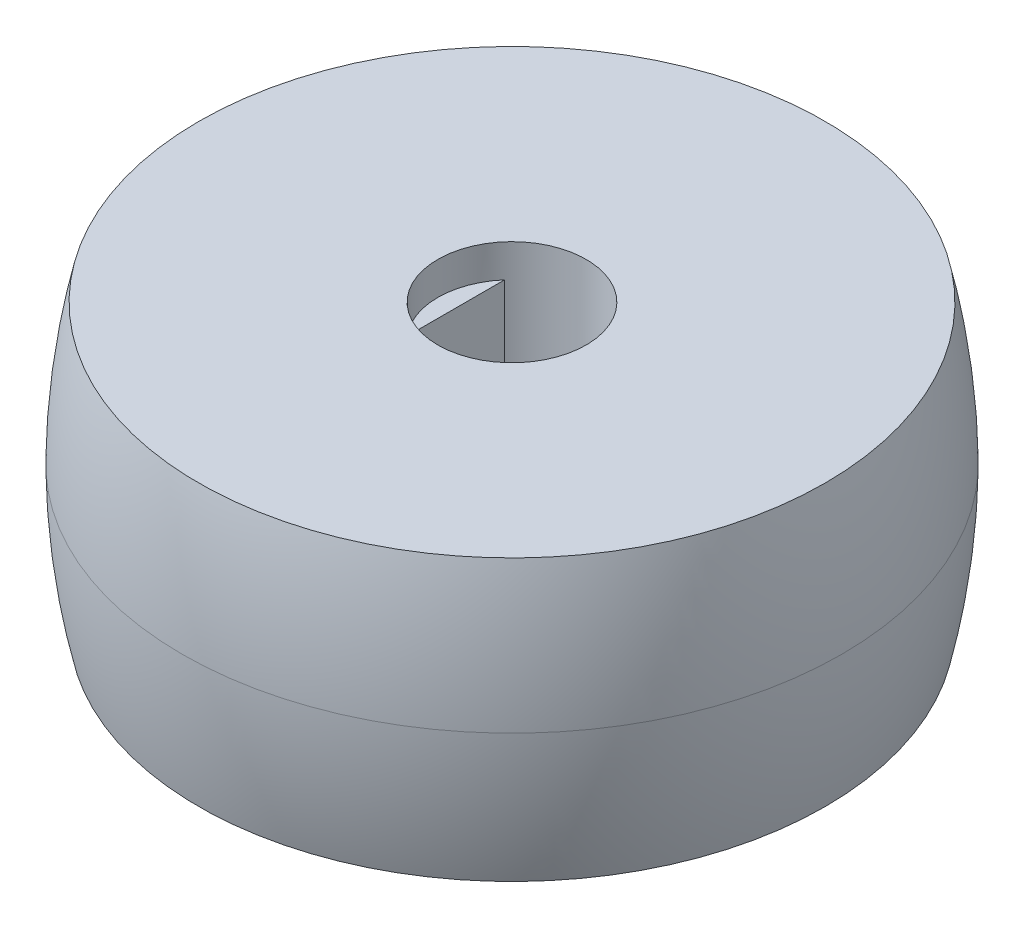
ISO-10303-21;
HEADER;
FILE_DESCRIPTION(('STEP AP214'),'2;1');
FILE_NAME('part.step','',(''),(''),'','','');
FILE_SCHEMA(('AUTOMOTIVE_DESIGN { 1 0 10303 214 1 1 1 1 }'));
ENDSEC;
DATA;
#1=APPLICATION_CONTEXT('core data for automotive mechanical design processes');
#2=APPLICATION_PROTOCOL_DEFINITION('international standard','automotive_design',2000,#1);
#3=PRODUCT_CONTEXT('',#1,'mechanical');
#4=PRODUCT('Part','Part','',(#3));
#5=PRODUCT_RELATED_PRODUCT_CATEGORY('part','',(#4));
#6=PRODUCT_DEFINITION_FORMATION('','',#4);
#7=PRODUCT_DEFINITION_CONTEXT('part definition',#1,'design');
#8=PRODUCT_DEFINITION('design','',#6,#7);
#9=PRODUCT_DEFINITION_SHAPE('','',#8);
#10=(LENGTH_UNIT() NAMED_UNIT(*) SI_UNIT(.MILLI.,.METRE.));
#11=(NAMED_UNIT(*) PLANE_ANGLE_UNIT() SI_UNIT($,.RADIAN.));
#12=(NAMED_UNIT(*) SI_UNIT($,.STERADIAN.) SOLID_ANGLE_UNIT());
#13=UNCERTAINTY_MEASURE_WITH_UNIT(LENGTH_MEASURE(1.E-05),#10,'distance_accuracy_value','');
#14=(GEOMETRIC_REPRESENTATION_CONTEXT(3) GLOBAL_UNCERTAINTY_ASSIGNED_CONTEXT((#13)) GLOBAL_UNIT_ASSIGNED_CONTEXT((#10,
#11,#12)) REPRESENTATION_CONTEXT('',''));
#15=CARTESIAN_POINT('',(0.,0.,0.));
#16=DIRECTION('',(0.,0.,1.));
#17=DIRECTION('',(1.,0.,0.));
#18=AXIS2_PLACEMENT_3D('',#15,#16,#17);
#19=CARTESIAN_POINT('',(0.,6.49999999999999,0.));
#20=DIRECTION('',(0.,1.,0.));
#21=DIRECTION('',(0.,0.,1.));
#22=AXIS2_PLACEMENT_3D('',#19,#20,#21);
#23=PLANE('',#22);
#24=CARTESIAN_POINT('',(0.,6.49999999999999,0.));
#25=DIRECTION('',(0.,1.,0.));
#26=DIRECTION('',(0.,0.,1.));
#27=AXIS2_PLACEMENT_3D('',#24,#25,#26);
#28=CIRCLE('',#27,4.5);
#29=CARTESIAN_POINT('',(-3.4,6.49999999999999,-2.94788059459674));
#30=VERTEX_POINT('',#29);
#31=CARTESIAN_POINT('',(-3.4,6.49999999999999,2.94788059459674));
#32=VERTEX_POINT('',#31);
#33=EDGE_CURVE('E138',#30,#32,#28,.T.);
#34=ORIENTED_EDGE('',*,*,#33,.T.);
#35=DIRECTION('',(0.,0.,-1.));
#36=VECTOR('',#35,1.);
#37=CARTESIAN_POINT('',(-3.4,6.49999999999999,0.));
#38=LINE('',#37,#36);
#39=EDGE_CURVE('E71',#32,#30,#38,.T.);
#40=ORIENTED_EDGE('',*,*,#39,.T.);
#41=EDGE_LOOP('',(#34,#40));
#42=FACE_BOUND('',#41,.T.);
#43=ADVANCED_FACE('F56',(#42),#23,.T.);
#44=CARTESIAN_POINT('',(0.,-8.49999999999999,0.));
#45=DIRECTION('',(0.,1.,0.));
#46=DIRECTION('',(0.,0.,1.));
#47=AXIS2_PLACEMENT_3D('',#44,#45,#46);
#48=CYLINDRICAL_SURFACE('',#47,1.65);
#49=CARTESIAN_POINT('',(0.,-8.49999999999999,0.));
#50=DIRECTION('',(0.,1.,0.));
#51=DIRECTION('',(0.,0.,1.));
#52=AXIS2_PLACEMENT_3D('',#49,#50,#51);
#53=CIRCLE('',#52,1.65);
#54=CARTESIAN_POINT('',(0.,-8.49999999999999,1.65));
#55=VERTEX_POINT('',#54);
#56=EDGE_CURVE('E131',#55,#55,#53,.T.);
#57=ORIENTED_EDGE('',*,*,#56,.F.);
#58=EDGE_LOOP('',(#57));
#59=FACE_BOUND('',#58,.T.);
#60=CARTESIAN_POINT('',(0.,1.99999999999999,0.));
#61=DIRECTION('',(0.,1.,0.));
#62=DIRECTION('',(0.,0.,1.));
#63=AXIS2_PLACEMENT_3D('',#60,#61,#62);
#64=CIRCLE('',#63,1.65);
#65=CARTESIAN_POINT('',(0.,1.99999999999999,1.65));
#66=VERTEX_POINT('',#65);
#67=EDGE_CURVE('E126',#66,#66,#64,.T.);
#68=ORIENTED_EDGE('',*,*,#67,.T.);
#69=EDGE_LOOP('',(#68));
#70=FACE_BOUND('',#69,.T.);
#71=ADVANCED_FACE('F159',(#59,#70),#48,.F.);
#72=CARTESIAN_POINT('',(0.,0.396827241567,0.));
#73=DIRECTION('',(0.,1.,0.));
#74=DIRECTION('',(-1.,0.,0.));
#75=AXIS2_PLACEMENT_3D('',#72,#73,#74);
#76=DEGENERATE_TOROIDAL_SURFACE('',#75,19.9980315533196,40.,.F.);
#77=CARTESIAN_POINT('',(0.,0.,0.));
#78=DIRECTION('',(0.,1.,0.));
#79=DIRECTION('',(-1.,0.,0.));
#80=AXIS2_PLACEMENT_3D('',#77,#78,#79);
#81=CIRCLE('',#80,20.);
#82=CARTESIAN_POINT('',(-20.,0.,0.));
#83=VERTEX_POINT('',#82);
#84=EDGE_CURVE('E12',#83,#83,#81,.T.);
#85=ORIENTED_EDGE('',*,*,#84,.F.);
#86=EDGE_LOOP('',(#85));
#87=FACE_BOUND('',#86,.T.);
#88=CARTESIAN_POINT('',(0.,-8.49999999999999,0.));
#89=DIRECTION('',(0.,1.,0.));
#90=DIRECTION('',(-1.,0.,0.));
#91=AXIS2_PLACEMENT_3D('',#88,#89,#90);
#92=CIRCLE('',#91,19.);
#93=CARTESIAN_POINT('',(-19.,-8.49999999999999,0.));
#94=VERTEX_POINT('',#93);
#95=EDGE_CURVE('E64',#94,#94,#92,.T.);
#96=ORIENTED_EDGE('',*,*,#95,.T.);
#97=EDGE_LOOP('',(#96));
#98=FACE_BOUND('',#97,.T.);
#99=ADVANCED_FACE('F58',(#87,#98),#76,.F.);
#100=CARTESIAN_POINT('',(0.,-8.49999999999999,0.));
#101=DIRECTION('',(0.,1.,0.));
#102=DIRECTION('',(-1.,0.,0.));
#103=AXIS2_PLACEMENT_3D('',#100,#101,#102);
#104=PLANE('',#103);
#105=ORIENTED_EDGE('',*,*,#56,.T.);
#106=EDGE_LOOP('',(#105));
#107=FACE_BOUND('',#106,.T.);
#108=ORIENTED_EDGE('',*,*,#95,.F.);
#109=EDGE_LOOP('',(#108));
#110=FACE_BOUND('',#109,.T.);
#111=ADVANCED_FACE('F146',(#107,#110),#104,.F.);
#112=CARTESIAN_POINT('',(0.,-0.396827241567,0.));
#113=DIRECTION('',(0.,-1.,0.));
#114=DIRECTION('',(-1.,0.,0.));
#115=AXIS2_PLACEMENT_3D('',#112,#113,#114);
#116=DEGENERATE_TOROIDAL_SURFACE('',#115,19.9980315533196,40.,.F.);
#117=ORIENTED_EDGE('',*,*,#84,.T.);
#118=EDGE_LOOP('',(#117));
#119=FACE_BOUND('',#118,.T.);
#120=CARTESIAN_POINT('',(0.,8.49999999999999,0.));
#121=DIRECTION('',(0.,1.,0.));
#122=DIRECTION('',(-1.,0.,0.));
#123=AXIS2_PLACEMENT_3D('',#120,#121,#122);
#124=CIRCLE('',#123,19.);
#125=CARTESIAN_POINT('',(-19.,8.49999999999999,0.));
#126=VERTEX_POINT('',#125);
#127=EDGE_CURVE('E137',#126,#126,#124,.T.);
#128=ORIENTED_EDGE('',*,*,#127,.F.);
#129=EDGE_LOOP('',(#128));
#130=FACE_BOUND('',#129,.T.);
#131=ADVANCED_FACE('F148',(#119,#130),#116,.F.);
#132=CARTESIAN_POINT('',(0.,8.49999999999999,0.));
#133=DIRECTION('',(0.,-1.,0.));
#134=DIRECTION('',(-1.,0.,0.));
#135=AXIS2_PLACEMENT_3D('',#132,#133,#134);
#136=PLANE('',#135);
#137=CARTESIAN_POINT('',(0.,8.49999999999999,0.));
#138=DIRECTION('',(0.,1.,0.));
#139=DIRECTION('',(0.,0.,1.));
#140=AXIS2_PLACEMENT_3D('',#137,#138,#139);
#141=CIRCLE('',#140,4.5);
#142=CARTESIAN_POINT('',(0.,8.49999999999999,4.5));
#143=VERTEX_POINT('',#142);
#144=EDGE_CURVE('E134',#143,#143,#141,.T.);
#145=ORIENTED_EDGE('',*,*,#144,.F.);
#146=EDGE_LOOP('',(#145));
#147=FACE_BOUND('',#146,.T.);
#148=ORIENTED_EDGE('',*,*,#127,.T.);
#149=EDGE_LOOP('',(#148));
#150=FACE_BOUND('',#149,.T.);
#151=ADVANCED_FACE('F155',(#147,#150),#136,.F.);
#152=CARTESIAN_POINT('',(0.,6.49999999999999,0.));
#153=DIRECTION('',(0.,1.,0.));
#154=DIRECTION('',(0.,0.,1.));
#155=AXIS2_PLACEMENT_3D('',#152,#153,#154);
#156=CYLINDRICAL_SURFACE('',#155,4.5);
#157=CARTESIAN_POINT('',(3.4,6.49999999999999,2.94788059459673));
#158=VERTEX_POINT('',#157);
#159=CARTESIAN_POINT('',(3.4,6.49999999999999,-2.94788059459674));
#160=VERTEX_POINT('',#159);
#161=EDGE_CURVE('E135',#158,#160,#28,.T.);
#162=ORIENTED_EDGE('',*,*,#161,.F.);
#163=DIRECTION('',(0.,1.,0.));
#164=VECTOR('',#163,1.);
#165=CARTESIAN_POINT('',(3.4,1.99999999999999,2.94788059459673));
#166=LINE('',#165,#164);
#167=CARTESIAN_POINT('',(3.4,1.99999999999999,2.94788059459673));
#168=VERTEX_POINT('',#167);
#169=EDGE_CURVE('E93',#168,#158,#166,.T.);
#170=ORIENTED_EDGE('',*,*,#169,.F.);
#171=CARTESIAN_POINT('',(0.,1.99999999999999,0.));
#172=DIRECTION('',(0.,1.,0.));
#173=DIRECTION('',(0.,0.,1.));
#174=AXIS2_PLACEMENT_3D('',#171,#172,#173);
#175=CIRCLE('',#174,4.5);
#176=CARTESIAN_POINT('',(-3.4,1.99999999999999,2.94788059459674));
#177=VERTEX_POINT('',#176);
#178=EDGE_CURVE('E120',#177,#168,#175,.T.);
#179=ORIENTED_EDGE('',*,*,#178,.F.);
#180=DIRECTION('',(0.,1.,0.));
#181=VECTOR('',#180,1.);
#182=CARTESIAN_POINT('',(-3.4,1.99999999999999,2.94788059459674));
#183=LINE('',#182,#181);
#184=EDGE_CURVE('E76',#177,#32,#183,.T.);
#185=ORIENTED_EDGE('',*,*,#184,.T.);
#186=ORIENTED_EDGE('',*,*,#33,.F.);
#187=DIRECTION('',(0.,1.,0.));
#188=VECTOR('',#187,1.);
#189=CARTESIAN_POINT('',(-3.4,1.99999999999999,-2.94788059459674));
#190=LINE('',#189,#188);
#191=CARTESIAN_POINT('',(-3.4,1.99999999999999,-2.94788059459674));
#192=VERTEX_POINT('',#191);
#193=EDGE_CURVE('E109',#192,#30,#190,.T.);
#194=ORIENTED_EDGE('',*,*,#193,.F.);
#195=CARTESIAN_POINT('',(0.,1.99999999999999,0.));
#196=DIRECTION('',(0.,1.,0.));
#197=DIRECTION('',(0.,0.,1.));
#198=AXIS2_PLACEMENT_3D('',#195,#196,#197);
#199=CIRCLE('',#198,4.5);
#200=CARTESIAN_POINT('',(3.4,1.99999999999999,-2.94788059459674));
#201=VERTEX_POINT('',#200);
#202=EDGE_CURVE('E112',#201,#192,#199,.T.);
#203=ORIENTED_EDGE('',*,*,#202,.F.);
#204=DIRECTION('',(0.,1.,0.));
#205=VECTOR('',#204,1.);
#206=CARTESIAN_POINT('',(3.4,1.99999999999999,-2.94788059459674));
#207=LINE('',#206,#205);
#208=EDGE_CURVE('E99',#201,#160,#207,.T.);
#209=ORIENTED_EDGE('',*,*,#208,.T.);
#210=EDGE_LOOP('',(#162,#170,#179,#185,#186,#194,#203,#209));
#211=FACE_BOUND('',#210,.T.);
#212=ORIENTED_EDGE('',*,*,#144,.T.);
#213=EDGE_LOOP('',(#212));
#214=FACE_BOUND('',#213,.T.);
#215=ADVANCED_FACE('F113',(#211,#214),#156,.F.);
#216=DIRECTION('',(0.,0.,-1.));
#217=VECTOR('',#216,1.);
#218=CARTESIAN_POINT('',(3.4,6.49999999999999,0.));
#219=LINE('',#218,#217);
#220=EDGE_CURVE('E105',#158,#160,#219,.T.);
#221=ORIENTED_EDGE('',*,*,#220,.F.);
#222=ORIENTED_EDGE('',*,*,#161,.T.);
#223=EDGE_LOOP('',(#221,#222));
#224=FACE_BOUND('',#223,.T.);
#225=ADVANCED_FACE('F163',(#224),#23,.T.);
#226=CARTESIAN_POINT('',(-3.4,1.99999999999999,0.));
#227=DIRECTION('',(1.,0.,0.));
#228=DIRECTION('',(0.,0.,-1.));
#229=AXIS2_PLACEMENT_3D('',#226,#227,#228);
#230=PLANE('',#229);
#231=ORIENTED_EDGE('',*,*,#39,.F.);
#232=ORIENTED_EDGE('',*,*,#184,.F.);
#233=DIRECTION('',(0.,0.,-1.));
#234=VECTOR('',#233,1.);
#235=CARTESIAN_POINT('',(-3.4,1.99999999999999,0.));
#236=LINE('',#235,#234);
#237=EDGE_CURVE('E96',#177,#192,#236,.T.);
#238=ORIENTED_EDGE('',*,*,#237,.T.);
#239=ORIENTED_EDGE('',*,*,#193,.T.);
#240=EDGE_LOOP('',(#231,#232,#238,#239));
#241=FACE_BOUND('',#240,.T.);
#242=ADVANCED_FACE('F172',(#241),#230,.T.);
#243=CARTESIAN_POINT('',(3.4,1.99999999999999,0.));
#244=DIRECTION('',(1.,0.,0.));
#245=DIRECTION('',(0.,0.,-1.));
#246=AXIS2_PLACEMENT_3D('',#243,#244,#245);
#247=PLANE('',#246);
#248=ORIENTED_EDGE('',*,*,#220,.T.);
#249=ORIENTED_EDGE('',*,*,#208,.F.);
#250=DIRECTION('',(0.,0.,-1.));
#251=VECTOR('',#250,1.);
#252=CARTESIAN_POINT('',(3.4,1.99999999999999,0.));
#253=LINE('',#252,#251);
#254=EDGE_CURVE('E103',#168,#201,#253,.T.);
#255=ORIENTED_EDGE('',*,*,#254,.F.);
#256=ORIENTED_EDGE('',*,*,#169,.T.);
#257=EDGE_LOOP('',(#248,#249,#255,#256));
#258=FACE_BOUND('',#257,.T.);
#259=ADVANCED_FACE('F101',(#258),#247,.F.);
#260=CARTESIAN_POINT('',(0.,1.99999999999999,0.));
#261=DIRECTION('',(0.,1.,0.));
#262=DIRECTION('',(0.,0.,1.));
#263=AXIS2_PLACEMENT_3D('',#260,#261,#262);
#264=PLANE('',#263);
#265=ORIENTED_EDGE('',*,*,#67,.F.);
#266=EDGE_LOOP('',(#265));
#267=FACE_BOUND('',#266,.T.);
#268=ORIENTED_EDGE('',*,*,#237,.F.);
#269=ORIENTED_EDGE('',*,*,#178,.T.);
#270=ORIENTED_EDGE('',*,*,#254,.T.);
#271=ORIENTED_EDGE('',*,*,#202,.T.);
#272=EDGE_LOOP('',(#268,#269,#270,#271));
#273=FACE_BOUND('',#272,.T.);
#274=ADVANCED_FACE('F118',(#267,#273),#264,.T.);
#275=CLOSED_SHELL('',(#43,#71,#99,#111,#131,#151,#215,#225,#242,#259,#274));
#276=MANIFOLD_SOLID_BREP('B2',#275);
#277=ADVANCED_BREP_SHAPE_REPRESENTATION('',(#18,#276),#14);
#278=SHAPE_DEFINITION_REPRESENTATION(#9,#277);
ENDSEC;
END-ISO-10303-21;
